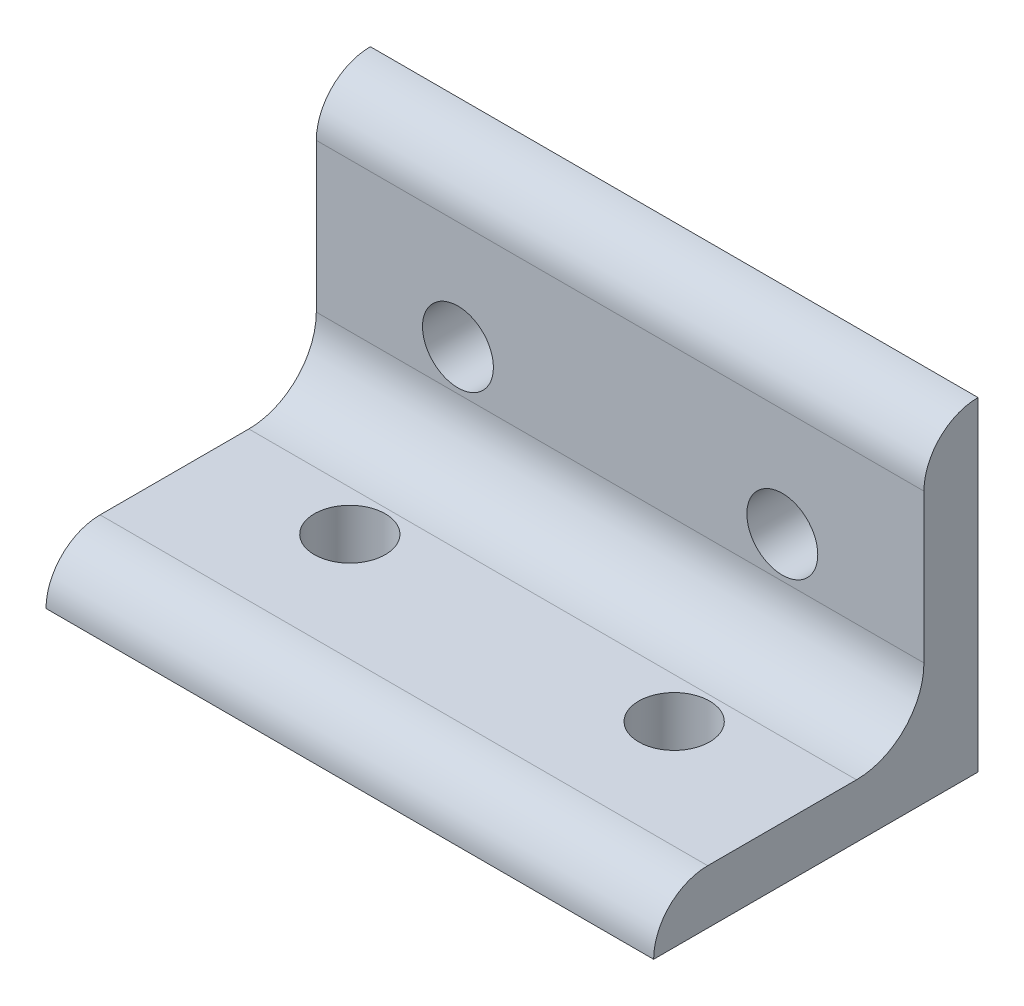
ISO-10303-21;
HEADER;
FILE_DESCRIPTION(('STEP AP214'),'2;1');
FILE_NAME('part.step','',(''),(''),'','','');
FILE_SCHEMA(('AUTOMOTIVE_DESIGN { 1 0 10303 214 1 1 1 1 }'));
ENDSEC;
DATA;
#1=APPLICATION_CONTEXT('core data for automotive mechanical design processes');
#2=APPLICATION_PROTOCOL_DEFINITION('international standard','automotive_design',2000,#1);
#3=PRODUCT_CONTEXT('',#1,'mechanical');
#4=PRODUCT('Part','Part','',(#3));
#5=PRODUCT_RELATED_PRODUCT_CATEGORY('part','',(#4));
#6=PRODUCT_DEFINITION_FORMATION('','',#4);
#7=PRODUCT_DEFINITION_CONTEXT('part definition',#1,'design');
#8=PRODUCT_DEFINITION('design','',#6,#7);
#9=PRODUCT_DEFINITION_SHAPE('','',#8);
#10=(LENGTH_UNIT() NAMED_UNIT(*) SI_UNIT(.MILLI.,.METRE.));
#11=(NAMED_UNIT(*) PLANE_ANGLE_UNIT() SI_UNIT($,.RADIAN.));
#12=(NAMED_UNIT(*) SI_UNIT($,.STERADIAN.) SOLID_ANGLE_UNIT());
#13=UNCERTAINTY_MEASURE_WITH_UNIT(LENGTH_MEASURE(1.E-05),#10,'distance_accuracy_value','');
#14=(GEOMETRIC_REPRESENTATION_CONTEXT(3) GLOBAL_UNCERTAINTY_ASSIGNED_CONTEXT((#13)) GLOBAL_UNIT_ASSIGNED_CONTEXT((#10,
#11,#12)) REPRESENTATION_CONTEXT('',''));
#15=CARTESIAN_POINT('',(0.,0.,0.));
#16=DIRECTION('',(0.,0.,1.));
#17=DIRECTION('',(1.,0.,0.));
#18=AXIS2_PLACEMENT_3D('',#15,#16,#17);
#19=CARTESIAN_POINT('',(-35.687,0.,31.7500000000007));
#20=DIRECTION('',(1.,0.,0.));
#21=DIRECTION('',(0.,0.,-1.));
#22=AXIS2_PLACEMENT_3D('',#19,#20,#21);
#23=CYLINDRICAL_SURFACE('',#22,6.34999999999924);
#24=CARTESIAN_POINT('',(35.687,0.,31.7500000000007));
#25=DIRECTION('',(1.,0.,0.));
#26=DIRECTION('',(0.,0.,-1.));
#27=AXIS2_PLACEMENT_3D('',#24,#25,#26);
#28=CIRCLE('',#27,6.34999999999924);
#29=CARTESIAN_POINT('',(35.687,6.34999999999924,31.7500000000007));
#30=VERTEX_POINT('',#29);
#31=CARTESIAN_POINT('',(35.687,0.,38.1));
#32=VERTEX_POINT('',#31);
#33=EDGE_CURVE('E135',#30,#32,#28,.T.);
#34=ORIENTED_EDGE('',*,*,#33,.F.);
#35=DIRECTION('',(1.,0.,0.));
#36=VECTOR('',#35,1.);
#37=CARTESIAN_POINT('',(-35.687,6.34999999999924,31.7500000000007));
#38=LINE('',#37,#36);
#39=CARTESIAN_POINT('',(-35.687,6.34999999999924,31.7500000000007));
#40=VERTEX_POINT('',#39);
#41=EDGE_CURVE('E118',#40,#30,#38,.T.);
#42=ORIENTED_EDGE('',*,*,#41,.F.);
#43=CARTESIAN_POINT('',(-35.687,0.,31.7500000000007));
#44=DIRECTION('',(1.,0.,0.));
#45=DIRECTION('',(0.,0.,-1.));
#46=AXIS2_PLACEMENT_3D('',#43,#44,#45);
#47=CIRCLE('',#46,6.34999999999924);
#48=CARTESIAN_POINT('',(-35.687,0.,38.1));
#49=VERTEX_POINT('',#48);
#50=EDGE_CURVE('E111',#40,#49,#47,.T.);
#51=ORIENTED_EDGE('',*,*,#50,.T.);
#52=DIRECTION('',(1.,0.,0.));
#53=VECTOR('',#52,1.);
#54=CARTESIAN_POINT('',(-35.687,0.,38.1));
#55=LINE('',#54,#53);
#56=EDGE_CURVE('E94',#49,#32,#55,.T.);
#57=ORIENTED_EDGE('',*,*,#56,.T.);
#58=EDGE_LOOP('',(#34,#42,#51,#57));
#59=FACE_BOUND('',#58,.T.);
#60=ADVANCED_FACE('F37',(#59),#23,.T.);
#61=CARTESIAN_POINT('',(-35.687,6.34999999999924,6.35));
#62=DIRECTION('',(0.,1.,0.));
#63=DIRECTION('',(0.,0.,1.));
#64=AXIS2_PLACEMENT_3D('',#61,#62,#63);
#65=PLANE('',#64);
#66=CARTESIAN_POINT('',(19.05,6.34999999999924,19.05));
#67=DIRECTION('',(0.,1.,0.));
#68=DIRECTION('',(0.,0.,1.));
#69=AXIS2_PLACEMENT_3D('',#66,#67,#68);
#70=CIRCLE('',#69,4.16560000000002);
#71=CARTESIAN_POINT('',(19.05,6.34999999999924,23.2156));
#72=VERTEX_POINT('',#71);
#73=EDGE_CURVE('E223',#72,#72,#70,.T.);
#74=ORIENTED_EDGE('',*,*,#73,.F.);
#75=EDGE_LOOP('',(#74));
#76=FACE_BOUND('',#75,.T.);
#77=CARTESIAN_POINT('',(-19.05,6.34999999999924,19.05));
#78=DIRECTION('',(0.,1.,0.));
#79=DIRECTION('',(0.,0.,1.));
#80=AXIS2_PLACEMENT_3D('',#77,#78,#79);
#81=CIRCLE('',#80,4.16560000000002);
#82=CARTESIAN_POINT('',(-19.05,6.34999999999924,23.2156));
#83=VERTEX_POINT('',#82);
#84=EDGE_CURVE('E216',#83,#83,#81,.T.);
#85=ORIENTED_EDGE('',*,*,#84,.F.);
#86=EDGE_LOOP('',(#85));
#87=FACE_BOUND('',#86,.T.);
#88=DIRECTION('',(0.,0.,1.));
#89=VECTOR('',#88,1.);
#90=CARTESIAN_POINT('',(35.687,6.34999999999924,6.35));
#91=LINE('',#90,#89);
#92=CARTESIAN_POINT('',(35.687,6.34999999999924,14.2748));
#93=VERTEX_POINT('',#92);
#94=EDGE_CURVE('E119',#93,#30,#91,.T.);
#95=ORIENTED_EDGE('',*,*,#94,.F.);
#96=DIRECTION('',(1.,0.,0.));
#97=VECTOR('',#96,1.);
#98=CARTESIAN_POINT('',(-35.687,6.34999999999924,14.2748));
#99=LINE('',#98,#97);
#100=CARTESIAN_POINT('',(-35.687,6.34999999999924,14.2748));
#101=VERTEX_POINT('',#100);
#102=EDGE_CURVE('E52',#93,#101,#99,.F.);
#103=ORIENTED_EDGE('',*,*,#102,.T.);
#104=DIRECTION('',(0.,0.,1.));
#105=VECTOR('',#104,1.);
#106=CARTESIAN_POINT('',(-35.687,6.34999999999924,6.35));
#107=LINE('',#106,#105);
#108=EDGE_CURVE('E105',#101,#40,#107,.T.);
#109=ORIENTED_EDGE('',*,*,#108,.T.);
#110=ORIENTED_EDGE('',*,*,#41,.T.);
#111=EDGE_LOOP('',(#95,#103,#109,#110));
#112=FACE_BOUND('',#111,.T.);
#113=ADVANCED_FACE('F175',(#76,#87,#112),#65,.T.);
#114=CARTESIAN_POINT('',(-35.687,31.75,6.35));
#115=DIRECTION('',(0.,0.,1.));
#116=DIRECTION('',(0.,-1.,0.));
#117=AXIS2_PLACEMENT_3D('',#114,#115,#116);
#118=PLANE('',#117);
#119=CARTESIAN_POINT('',(19.05,19.05,6.35));
#120=DIRECTION('',(0.,0.,1.));
#121=DIRECTION('',(1.,0.,0.));
#122=AXIS2_PLACEMENT_3D('',#119,#120,#121);
#123=CIRCLE('',#122,4.16560000000002);
#124=CARTESIAN_POINT('',(23.2156,19.05,6.35));
#125=VERTEX_POINT('',#124);
#126=EDGE_CURVE('E220',#125,#125,#123,.T.);
#127=ORIENTED_EDGE('',*,*,#126,.F.);
#128=EDGE_LOOP('',(#127));
#129=FACE_BOUND('',#128,.T.);
#130=CARTESIAN_POINT('',(-19.05,19.05,6.35));
#131=DIRECTION('',(0.,0.,1.));
#132=DIRECTION('',(1.,0.,0.));
#133=AXIS2_PLACEMENT_3D('',#130,#131,#132);
#134=CIRCLE('',#133,4.16560000000002);
#135=CARTESIAN_POINT('',(-14.8844,19.05,6.35));
#136=VERTEX_POINT('',#135);
#137=EDGE_CURVE('E231',#136,#136,#134,.T.);
#138=ORIENTED_EDGE('',*,*,#137,.F.);
#139=EDGE_LOOP('',(#138));
#140=FACE_BOUND('',#139,.T.);
#141=DIRECTION('',(0.,-1.,0.));
#142=VECTOR('',#141,1.);
#143=CARTESIAN_POINT('',(-35.687,31.75,6.35));
#144=LINE('',#143,#142);
#145=CARTESIAN_POINT('',(-35.687,31.75,6.35));
#146=VERTEX_POINT('',#145);
#147=CARTESIAN_POINT('',(-35.687,14.2747999999992,6.35));
#148=VERTEX_POINT('',#147);
#149=EDGE_CURVE('E131',#146,#148,#144,.T.);
#150=ORIENTED_EDGE('',*,*,#149,.T.);
#151=DIRECTION('',(1.,0.,0.));
#152=VECTOR('',#151,1.);
#153=CARTESIAN_POINT('',(35.687,14.2747999999992,6.35));
#154=LINE('',#153,#152);
#155=CARTESIAN_POINT('',(35.687,14.2747999999992,6.35));
#156=VERTEX_POINT('',#155);
#157=EDGE_CURVE('E146',#148,#156,#154,.T.);
#158=ORIENTED_EDGE('',*,*,#157,.T.);
#159=DIRECTION('',(0.,-1.,0.));
#160=VECTOR('',#159,1.);
#161=CARTESIAN_POINT('',(35.687,31.75,6.35));
#162=LINE('',#161,#160);
#163=CARTESIAN_POINT('',(35.687,31.75,6.35));
#164=VERTEX_POINT('',#163);
#165=EDGE_CURVE('E121',#164,#156,#162,.T.);
#166=ORIENTED_EDGE('',*,*,#165,.F.);
#167=DIRECTION('',(1.,0.,0.));
#168=VECTOR('',#167,1.);
#169=CARTESIAN_POINT('',(-35.687,31.75,6.35));
#170=LINE('',#169,#168);
#171=EDGE_CURVE('E147',#146,#164,#170,.T.);
#172=ORIENTED_EDGE('',*,*,#171,.F.);
#173=EDGE_LOOP('',(#150,#158,#166,#172));
#174=FACE_BOUND('',#173,.T.);
#175=ADVANCED_FACE('F157',(#129,#140,#174),#118,.T.);
#176=CARTESIAN_POINT('',(-35.687,31.75,7.57266759817096E-13));
#177=DIRECTION('',(1.,0.,0.));
#178=DIRECTION('',(0.,0.,-1.));
#179=AXIS2_PLACEMENT_3D('',#176,#177,#178);
#180=CYLINDRICAL_SURFACE('',#179,6.34999999999924);
#181=CARTESIAN_POINT('',(35.687,31.75,7.57266759817096E-13));
#182=DIRECTION('',(1.,0.,0.));
#183=DIRECTION('',(0.,0.,-1.));
#184=AXIS2_PLACEMENT_3D('',#181,#182,#183);
#185=CIRCLE('',#184,6.34999999999924);
#186=CARTESIAN_POINT('',(35.687,38.0999999999992,7.56877934458367E-13));
#187=VERTEX_POINT('',#186);
#188=EDGE_CURVE('E141',#187,#164,#185,.T.);
#189=ORIENTED_EDGE('',*,*,#188,.F.);
#190=DIRECTION('',(1.,0.,0.));
#191=VECTOR('',#190,1.);
#192=CARTESIAN_POINT('',(-35.687,38.0999999999992,7.56877934458367E-13));
#193=LINE('',#192,#191);
#194=CARTESIAN_POINT('',(-35.687,38.0999999999992,7.56877934458367E-13));
#195=VERTEX_POINT('',#194);
#196=EDGE_CURVE('E149',#195,#187,#193,.T.);
#197=ORIENTED_EDGE('',*,*,#196,.F.);
#198=CARTESIAN_POINT('',(-35.687,31.75,7.57266759817096E-13));
#199=DIRECTION('',(1.,0.,0.));
#200=DIRECTION('',(0.,0.,-1.));
#201=AXIS2_PLACEMENT_3D('',#198,#199,#200);
#202=CIRCLE('',#201,6.34999999999924);
#203=EDGE_CURVE('E128',#195,#146,#202,.T.);
#204=ORIENTED_EDGE('',*,*,#203,.T.);
#205=ORIENTED_EDGE('',*,*,#171,.T.);
#206=EDGE_LOOP('',(#189,#197,#204,#205));
#207=FACE_BOUND('',#206,.T.);
#208=ADVANCED_FACE('F165',(#207),#180,.T.);
#209=CARTESIAN_POINT('',(-35.687,0.,7.56339435525888E-13));
#210=DIRECTION('',(0.,0.,-1.));
#211=DIRECTION('',(0.,1.,0.));
#212=AXIS2_PLACEMENT_3D('',#209,#210,#211);
#213=PLANE('',#212);
#214=CARTESIAN_POINT('',(19.05,19.05,0.));
#215=DIRECTION('',(0.,0.,1.));
#216=DIRECTION('',(1.,0.,0.));
#217=AXIS2_PLACEMENT_3D('',#214,#215,#216);
#218=CIRCLE('',#217,4.16560000000002);
#219=CARTESIAN_POINT('',(23.2156,19.05,0.));
#220=VERTEX_POINT('',#219);
#221=EDGE_CURVE('E229',#220,#220,#218,.T.);
#222=ORIENTED_EDGE('',*,*,#221,.T.);
#223=EDGE_LOOP('',(#222));
#224=FACE_BOUND('',#223,.T.);
#225=CARTESIAN_POINT('',(-19.05,19.05,0.));
#226=DIRECTION('',(0.,0.,1.));
#227=DIRECTION('',(1.,0.,0.));
#228=AXIS2_PLACEMENT_3D('',#225,#226,#227);
#229=CIRCLE('',#228,4.16560000000002);
#230=CARTESIAN_POINT('',(-14.8844,19.05,0.));
#231=VERTEX_POINT('',#230);
#232=EDGE_CURVE('E124',#231,#231,#229,.T.);
#233=ORIENTED_EDGE('',*,*,#232,.T.);
#234=EDGE_LOOP('',(#233));
#235=FACE_BOUND('',#234,.T.);
#236=DIRECTION('',(0.,1.,0.));
#237=VECTOR('',#236,1.);
#238=CARTESIAN_POINT('',(35.687,0.,7.56339435525888E-13));
#239=LINE('',#238,#237);
#240=CARTESIAN_POINT('',(35.687,0.,7.56339435525888E-13));
#241=VERTEX_POINT('',#240);
#242=EDGE_CURVE('E138',#241,#187,#239,.T.);
#243=ORIENTED_EDGE('',*,*,#242,.F.);
#244=DIRECTION('',(1.,0.,0.));
#245=VECTOR('',#244,1.);
#246=CARTESIAN_POINT('',(-35.687,0.,7.56339435525888E-13));
#247=LINE('',#246,#245);
#248=CARTESIAN_POINT('',(-35.687,0.,7.56339435525888E-13));
#249=VERTEX_POINT('',#248);
#250=EDGE_CURVE('E104',#249,#241,#247,.T.);
#251=ORIENTED_EDGE('',*,*,#250,.F.);
#252=DIRECTION('',(0.,1.,0.));
#253=VECTOR('',#252,1.);
#254=CARTESIAN_POINT('',(-35.687,0.,7.56339435525888E-13));
#255=LINE('',#254,#253);
#256=EDGE_CURVE('E114',#249,#195,#255,.T.);
#257=ORIENTED_EDGE('',*,*,#256,.T.);
#258=ORIENTED_EDGE('',*,*,#196,.T.);
#259=EDGE_LOOP('',(#243,#251,#257,#258));
#260=FACE_BOUND('',#259,.T.);
#261=ADVANCED_FACE('F184',(#224,#235,#260),#213,.T.);
#262=CARTESIAN_POINT('',(-35.687,0.,38.1));
#263=DIRECTION('',(0.,-1.,0.));
#264=DIRECTION('',(0.,0.,-1.));
#265=AXIS2_PLACEMENT_3D('',#262,#263,#264);
#266=PLANE('',#265);
#267=CARTESIAN_POINT('',(19.05,0.,19.05));
#268=DIRECTION('',(0.,1.,0.));
#269=DIRECTION('',(0.,0.,1.));
#270=AXIS2_PLACEMENT_3D('',#267,#268,#269);
#271=CIRCLE('',#270,4.16560000000002);
#272=CARTESIAN_POINT('',(19.05,0.,23.2156));
#273=VERTEX_POINT('',#272);
#274=EDGE_CURVE('E218',#273,#273,#271,.T.);
#275=ORIENTED_EDGE('',*,*,#274,.T.);
#276=EDGE_LOOP('',(#275));
#277=FACE_BOUND('',#276,.T.);
#278=CARTESIAN_POINT('',(-19.05,0.,19.05));
#279=DIRECTION('',(0.,1.,0.));
#280=DIRECTION('',(0.,0.,1.));
#281=AXIS2_PLACEMENT_3D('',#278,#279,#280);
#282=CIRCLE('',#281,4.16560000000002);
#283=CARTESIAN_POINT('',(-19.05,0.,23.2156));
#284=VERTEX_POINT('',#283);
#285=EDGE_CURVE('E213',#284,#284,#282,.T.);
#286=ORIENTED_EDGE('',*,*,#285,.T.);
#287=EDGE_LOOP('',(#286));
#288=FACE_BOUND('',#287,.T.);
#289=DIRECTION('',(0.,0.,-1.));
#290=VECTOR('',#289,1.);
#291=CARTESIAN_POINT('',(35.687,0.,38.1));
#292=LINE('',#291,#290);
#293=EDGE_CURVE('E99',#32,#241,#292,.T.);
#294=ORIENTED_EDGE('',*,*,#293,.F.);
#295=ORIENTED_EDGE('',*,*,#56,.F.);
#296=DIRECTION('',(0.,0.,-1.));
#297=VECTOR('',#296,1.);
#298=CARTESIAN_POINT('',(-35.687,0.,38.1));
#299=LINE('',#298,#297);
#300=EDGE_CURVE('E97',#49,#249,#299,.T.);
#301=ORIENTED_EDGE('',*,*,#300,.T.);
#302=ORIENTED_EDGE('',*,*,#250,.T.);
#303=EDGE_LOOP('',(#294,#295,#301,#302));
#304=FACE_BOUND('',#303,.T.);
#305=ADVANCED_FACE('F96',(#277,#288,#304),#266,.T.);
#306=CARTESIAN_POINT('',(-35.687,0.,31.7500000000007));
#307=DIRECTION('',(1.,0.,0.));
#308=DIRECTION('',(0.,0.,-1.));
#309=AXIS2_PLACEMENT_3D('',#306,#307,#308);
#310=PLANE('',#309);
#311=ORIENTED_EDGE('',*,*,#50,.F.);
#312=ORIENTED_EDGE('',*,*,#108,.F.);
#313=CARTESIAN_POINT('',(-35.687,14.2747999999992,14.2748));
#314=DIRECTION('',(1.,0.,0.));
#315=DIRECTION('',(0.,0.,-1.));
#316=AXIS2_PLACEMENT_3D('',#313,#314,#315);
#317=CIRCLE('',#316,7.9248);
#318=EDGE_CURVE('E11',#101,#148,#317,.T.);
#319=ORIENTED_EDGE('',*,*,#318,.T.);
#320=ORIENTED_EDGE('',*,*,#149,.F.);
#321=ORIENTED_EDGE('',*,*,#203,.F.);
#322=ORIENTED_EDGE('',*,*,#256,.F.);
#323=ORIENTED_EDGE('',*,*,#300,.F.);
#324=EDGE_LOOP('',(#311,#312,#319,#320,#321,#322,#323));
#325=FACE_BOUND('',#324,.T.);
#326=ADVANCED_FACE('F110',(#325),#310,.F.);
#327=CARTESIAN_POINT('',(35.687,0.,31.7500000000007));
#328=DIRECTION('',(1.,0.,0.));
#329=DIRECTION('',(0.,0.,-1.));
#330=AXIS2_PLACEMENT_3D('',#327,#328,#329);
#331=PLANE('',#330);
#332=ORIENTED_EDGE('',*,*,#33,.T.);
#333=ORIENTED_EDGE('',*,*,#293,.T.);
#334=ORIENTED_EDGE('',*,*,#242,.T.);
#335=ORIENTED_EDGE('',*,*,#188,.T.);
#336=ORIENTED_EDGE('',*,*,#165,.T.);
#337=CARTESIAN_POINT('',(35.687,14.2747999999992,14.2748));
#338=DIRECTION('',(1.,0.,0.));
#339=DIRECTION('',(0.,0.,-1.));
#340=AXIS2_PLACEMENT_3D('',#337,#338,#339);
#341=CIRCLE('',#340,7.9248);
#342=EDGE_CURVE('E45',#156,#93,#341,.F.);
#343=ORIENTED_EDGE('',*,*,#342,.T.);
#344=ORIENTED_EDGE('',*,*,#94,.T.);
#345=EDGE_LOOP('',(#332,#333,#334,#335,#336,#343,#344));
#346=FACE_BOUND('',#345,.T.);
#347=ADVANCED_FACE('F161',(#346),#331,.T.);
#348=CARTESIAN_POINT('',(-19.05,19.05,6.35));
#349=DIRECTION('',(0.,0.,1.));
#350=DIRECTION('',(1.,0.,0.));
#351=AXIS2_PLACEMENT_3D('',#348,#349,#350);
#352=CYLINDRICAL_SURFACE('',#351,4.16560000000002);
#353=ORIENTED_EDGE('',*,*,#232,.F.);
#354=EDGE_LOOP('',(#353));
#355=FACE_BOUND('',#354,.T.);
#356=ORIENTED_EDGE('',*,*,#137,.T.);
#357=EDGE_LOOP('',(#356));
#358=FACE_BOUND('',#357,.T.);
#359=ADVANCED_FACE('F196',(#355,#358),#352,.F.);
#360=CARTESIAN_POINT('',(19.05,19.05,6.35));
#361=DIRECTION('',(0.,0.,1.));
#362=DIRECTION('',(1.,0.,0.));
#363=AXIS2_PLACEMENT_3D('',#360,#361,#362);
#364=CYLINDRICAL_SURFACE('',#363,4.16560000000002);
#365=ORIENTED_EDGE('',*,*,#221,.F.);
#366=EDGE_LOOP('',(#365));
#367=FACE_BOUND('',#366,.T.);
#368=ORIENTED_EDGE('',*,*,#126,.T.);
#369=EDGE_LOOP('',(#368));
#370=FACE_BOUND('',#369,.T.);
#371=ADVANCED_FACE('F201',(#367,#370),#364,.F.);
#372=CARTESIAN_POINT('',(-19.05,6.34999999999924,19.05));
#373=DIRECTION('',(0.,1.,0.));
#374=DIRECTION('',(0.,0.,1.));
#375=AXIS2_PLACEMENT_3D('',#372,#373,#374);
#376=CYLINDRICAL_SURFACE('',#375,4.16560000000002);
#377=ORIENTED_EDGE('',*,*,#285,.F.);
#378=EDGE_LOOP('',(#377));
#379=FACE_BOUND('',#378,.T.);
#380=ORIENTED_EDGE('',*,*,#84,.T.);
#381=EDGE_LOOP('',(#380));
#382=FACE_BOUND('',#381,.T.);
#383=ADVANCED_FACE('F171',(#379,#382),#376,.F.);
#384=CARTESIAN_POINT('',(19.05,6.34999999999924,19.05));
#385=DIRECTION('',(0.,1.,0.));
#386=DIRECTION('',(0.,0.,1.));
#387=AXIS2_PLACEMENT_3D('',#384,#385,#386);
#388=CYLINDRICAL_SURFACE('',#387,4.16560000000002);
#389=ORIENTED_EDGE('',*,*,#274,.F.);
#390=EDGE_LOOP('',(#389));
#391=FACE_BOUND('',#390,.T.);
#392=ORIENTED_EDGE('',*,*,#73,.T.);
#393=EDGE_LOOP('',(#392));
#394=FACE_BOUND('',#393,.T.);
#395=ADVANCED_FACE('F167',(#391,#394),#388,.F.);
#396=CARTESIAN_POINT('',(-35.687,14.2747999999992,14.2748));
#397=DIRECTION('',(-1.,0.,0.));
#398=DIRECTION('',(0.,0.,1.));
#399=AXIS2_PLACEMENT_3D('',#396,#397,#398);
#400=CYLINDRICAL_SURFACE('',#399,7.9248);
#401=ORIENTED_EDGE('',*,*,#318,.F.);
#402=ORIENTED_EDGE('',*,*,#102,.F.);
#403=ORIENTED_EDGE('',*,*,#342,.F.);
#404=ORIENTED_EDGE('',*,*,#157,.F.);
#405=EDGE_LOOP('',(#401,#402,#403,#404));
#406=FACE_BOUND('',#405,.T.);
#407=ADVANCED_FACE('F39',(#406),#400,.F.);
#408=CLOSED_SHELL('',(#60,#113,#175,#208,#261,#305,#326,#347,#359,#371,#383,#395,#407));
#409=MANIFOLD_SOLID_BREP('B2',#408);
#410=ADVANCED_BREP_SHAPE_REPRESENTATION('',(#18,#409),#14);
#411=SHAPE_DEFINITION_REPRESENTATION(#9,#410);
ENDSEC;
END-ISO-10303-21;
